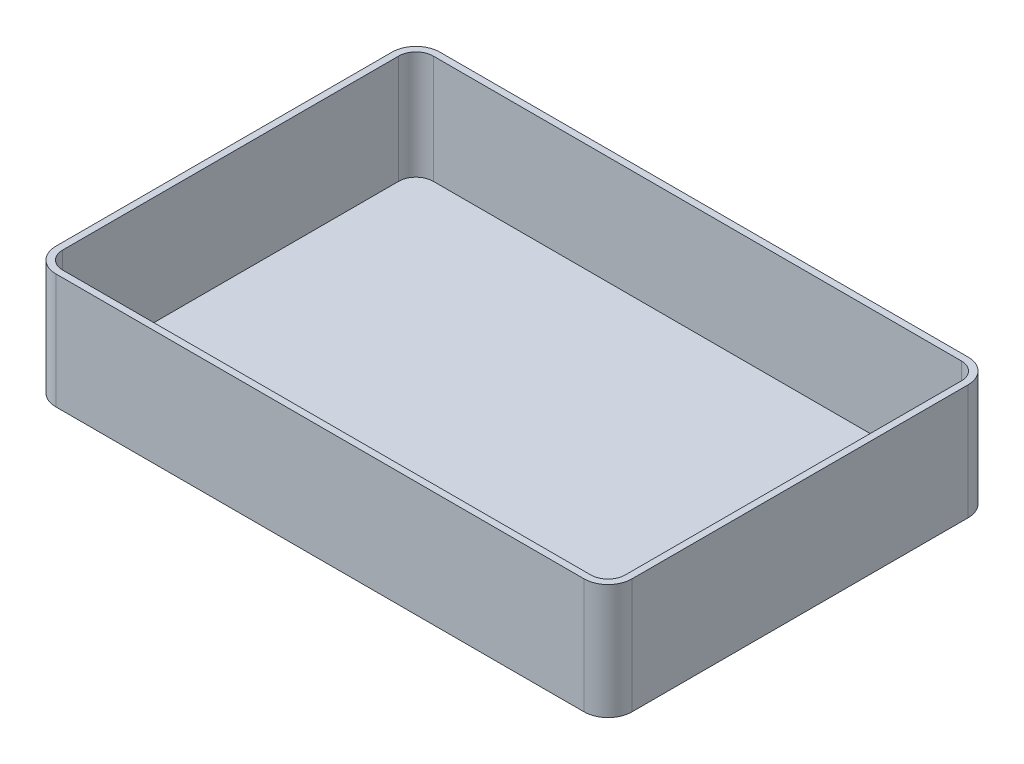
ISO-10303-21;
HEADER;
FILE_DESCRIPTION(('STEP AP214'),'2;1');
FILE_NAME('part.step','',(''),(''),'','','');
FILE_SCHEMA(('AUTOMOTIVE_DESIGN { 1 0 10303 214 1 1 1 1 }'));
ENDSEC;
DATA;
#1=APPLICATION_CONTEXT('core data for automotive mechanical design processes');
#2=APPLICATION_PROTOCOL_DEFINITION('international standard','automotive_design',2000,#1);
#3=PRODUCT_CONTEXT('',#1,'mechanical');
#4=PRODUCT('Part','Part','',(#3));
#5=PRODUCT_RELATED_PRODUCT_CATEGORY('part','',(#4));
#6=PRODUCT_DEFINITION_FORMATION('','',#4);
#7=PRODUCT_DEFINITION_CONTEXT('part definition',#1,'design');
#8=PRODUCT_DEFINITION('design','',#6,#7);
#9=PRODUCT_DEFINITION_SHAPE('','',#8);
#10=(LENGTH_UNIT() NAMED_UNIT(*) SI_UNIT(.MILLI.,.METRE.));
#11=(NAMED_UNIT(*) PLANE_ANGLE_UNIT() SI_UNIT($,.RADIAN.));
#12=(NAMED_UNIT(*) SI_UNIT($,.STERADIAN.) SOLID_ANGLE_UNIT());
#13=UNCERTAINTY_MEASURE_WITH_UNIT(LENGTH_MEASURE(1.E-05),#10,'distance_accuracy_value','');
#14=(GEOMETRIC_REPRESENTATION_CONTEXT(3) GLOBAL_UNCERTAINTY_ASSIGNED_CONTEXT((#13)) GLOBAL_UNIT_ASSIGNED_CONTEXT((#10,
#11,#12)) REPRESENTATION_CONTEXT('',''));
#15=CARTESIAN_POINT('',(0.,0.,0.));
#16=DIRECTION('',(0.,0.,1.));
#17=DIRECTION('',(1.,0.,0.));
#18=AXIS2_PLACEMENT_3D('',#15,#16,#17);
#19=CARTESIAN_POINT('',(275.,120.,-175.));
#20=DIRECTION('',(0.,-1.,0.));
#21=DIRECTION('',(0.,0.,-1.));
#22=AXIS2_PLACEMENT_3D('',#19,#20,#21);
#23=PLANE('',#22);
#24=CARTESIAN_POINT('',(275.,120.,-175.));
#25=DIRECTION('',(0.,1.,0.));
#26=DIRECTION('',(0.,0.,-1.));
#27=AXIS2_PLACEMENT_3D('',#24,#25,#26);
#28=CIRCLE('',#27,25.);
#29=CARTESIAN_POINT('',(300.,120.,-175.));
#30=VERTEX_POINT('',#29);
#31=CARTESIAN_POINT('',(275.,120.,-200.));
#32=VERTEX_POINT('',#31);
#33=EDGE_CURVE('E161',#30,#32,#28,.T.);
#34=ORIENTED_EDGE('',*,*,#33,.T.);
#35=DIRECTION('',(-1.,0.,0.));
#36=VECTOR('',#35,1.);
#37=CARTESIAN_POINT('',(-275.,120.,-200.));
#38=LINE('',#37,#36);
#39=CARTESIAN_POINT('',(-275.,120.,-200.));
#40=VERTEX_POINT('',#39);
#41=EDGE_CURVE('E102',#32,#40,#38,.T.);
#42=ORIENTED_EDGE('',*,*,#41,.T.);
#43=CARTESIAN_POINT('',(-275.,120.,-175.));
#44=DIRECTION('',(0.,1.,0.));
#45=DIRECTION('',(0.,0.,-1.));
#46=AXIS2_PLACEMENT_3D('',#43,#44,#45);
#47=CIRCLE('',#46,25.);
#48=CARTESIAN_POINT('',(-300.,120.,-175.));
#49=VERTEX_POINT('',#48);
#50=EDGE_CURVE('E176',#40,#49,#47,.T.);
#51=ORIENTED_EDGE('',*,*,#50,.T.);
#52=DIRECTION('',(0.,0.,1.));
#53=VECTOR('',#52,1.);
#54=CARTESIAN_POINT('',(-300.,120.,175.));
#55=LINE('',#54,#53);
#56=CARTESIAN_POINT('',(-300.,120.,175.));
#57=VERTEX_POINT('',#56);
#58=EDGE_CURVE('E188',#49,#57,#55,.T.);
#59=ORIENTED_EDGE('',*,*,#58,.T.);
#60=CARTESIAN_POINT('',(-275.,120.,175.));
#61=DIRECTION('',(0.,1.,0.));
#62=DIRECTION('',(0.,0.,-1.));
#63=AXIS2_PLACEMENT_3D('',#60,#61,#62);
#64=CIRCLE('',#63,25.);
#65=CARTESIAN_POINT('',(-275.,120.,200.));
#66=VERTEX_POINT('',#65);
#67=EDGE_CURVE('E124',#57,#66,#64,.T.);
#68=ORIENTED_EDGE('',*,*,#67,.T.);
#69=DIRECTION('',(1.,0.,0.));
#70=VECTOR('',#69,1.);
#71=CARTESIAN_POINT('',(-275.,120.,200.));
#72=LINE('',#71,#70);
#73=CARTESIAN_POINT('',(275.,120.,200.));
#74=VERTEX_POINT('',#73);
#75=EDGE_CURVE('E117',#66,#74,#72,.T.);
#76=ORIENTED_EDGE('',*,*,#75,.T.);
#77=CARTESIAN_POINT('',(275.,120.,175.));
#78=DIRECTION('',(0.,1.,0.));
#79=DIRECTION('',(0.,0.,1.));
#80=AXIS2_PLACEMENT_3D('',#77,#78,#79);
#81=CIRCLE('',#80,25.);
#82=CARTESIAN_POINT('',(300.,120.,175.));
#83=VERTEX_POINT('',#82);
#84=EDGE_CURVE('E121',#74,#83,#81,.T.);
#85=ORIENTED_EDGE('',*,*,#84,.T.);
#86=DIRECTION('',(0.,0.,-1.));
#87=VECTOR('',#86,1.);
#88=CARTESIAN_POINT('',(300.,120.,175.));
#89=LINE('',#88,#87);
#90=EDGE_CURVE('E61',#83,#30,#89,.T.);
#91=ORIENTED_EDGE('',*,*,#90,.T.);
#92=EDGE_LOOP('',(#34,#42,#51,#59,#68,#76,#85,#91));
#93=FACE_BOUND('',#92,.T.);
#94=CARTESIAN_POINT('',(275.,120.,-175.));
#95=DIRECTION('',(0.,-1.,0.));
#96=DIRECTION('',(0.,0.,-1.));
#97=AXIS2_PLACEMENT_3D('',#94,#95,#96);
#98=CIRCLE('',#97,18.);
#99=CARTESIAN_POINT('',(293.,120.,-175.));
#100=VERTEX_POINT('',#99);
#101=CARTESIAN_POINT('',(275.,120.,-193.));
#102=VERTEX_POINT('',#101);
#103=EDGE_CURVE('E214',#100,#102,#98,.F.);
#104=ORIENTED_EDGE('',*,*,#103,.F.);
#105=DIRECTION('',(0.,0.,-1.));
#106=VECTOR('',#105,1.);
#107=CARTESIAN_POINT('',(293.,120.,-175.));
#108=LINE('',#107,#106);
#109=CARTESIAN_POINT('',(293.,120.,175.));
#110=VERTEX_POINT('',#109);
#111=EDGE_CURVE('E194',#110,#100,#108,.T.);
#112=ORIENTED_EDGE('',*,*,#111,.F.);
#113=CARTESIAN_POINT('',(275.,120.,175.));
#114=DIRECTION('',(0.,-1.,0.));
#115=DIRECTION('',(0.,0.,-1.));
#116=AXIS2_PLACEMENT_3D('',#113,#114,#115);
#117=CIRCLE('',#116,18.);
#118=CARTESIAN_POINT('',(275.,120.,193.));
#119=VERTEX_POINT('',#118);
#120=EDGE_CURVE('E197',#119,#110,#117,.F.);
#121=ORIENTED_EDGE('',*,*,#120,.F.);
#122=DIRECTION('',(1.,0.,0.));
#123=VECTOR('',#122,1.);
#124=CARTESIAN_POINT('',(275.,120.,193.));
#125=LINE('',#124,#123);
#126=CARTESIAN_POINT('',(-275.,120.,193.));
#127=VERTEX_POINT('',#126);
#128=EDGE_CURVE('E199',#127,#119,#125,.T.);
#129=ORIENTED_EDGE('',*,*,#128,.F.);
#130=CARTESIAN_POINT('',(-275.,120.,175.));
#131=DIRECTION('',(0.,-1.,0.));
#132=DIRECTION('',(0.,0.,-1.));
#133=AXIS2_PLACEMENT_3D('',#130,#131,#132);
#134=CIRCLE('',#133,18.);
#135=CARTESIAN_POINT('',(-293.,120.,175.));
#136=VERTEX_POINT('',#135);
#137=EDGE_CURVE('E202',#136,#127,#134,.F.);
#138=ORIENTED_EDGE('',*,*,#137,.F.);
#139=DIRECTION('',(0.,0.,1.));
#140=VECTOR('',#139,1.);
#141=CARTESIAN_POINT('',(-293.,120.,-175.));
#142=LINE('',#141,#140);
#143=CARTESIAN_POINT('',(-293.,120.,-175.));
#144=VERTEX_POINT('',#143);
#145=EDGE_CURVE('E205',#144,#136,#142,.T.);
#146=ORIENTED_EDGE('',*,*,#145,.F.);
#147=CARTESIAN_POINT('',(-275.,120.,-175.));
#148=DIRECTION('',(0.,-1.,0.));
#149=DIRECTION('',(0.,0.,-1.));
#150=AXIS2_PLACEMENT_3D('',#147,#148,#149);
#151=CIRCLE('',#150,18.);
#152=CARTESIAN_POINT('',(-275.,120.,-193.));
#153=VERTEX_POINT('',#152);
#154=EDGE_CURVE('E208',#153,#144,#151,.F.);
#155=ORIENTED_EDGE('',*,*,#154,.F.);
#156=DIRECTION('',(-1.,0.,0.));
#157=VECTOR('',#156,1.);
#158=CARTESIAN_POINT('',(275.,120.,-193.));
#159=LINE('',#158,#157);
#160=EDGE_CURVE('E211',#102,#153,#159,.T.);
#161=ORIENTED_EDGE('',*,*,#160,.F.);
#162=EDGE_LOOP('',(#104,#112,#121,#129,#138,#146,#155,#161));
#163=FACE_BOUND('',#162,.T.);
#164=ADVANCED_FACE('F37',(#93,#163),#23,.F.);
#165=CARTESIAN_POINT('',(275.,120.,-175.));
#166=DIRECTION('',(0.,-1.,0.));
#167=DIRECTION('',(0.,0.,-1.));
#168=AXIS2_PLACEMENT_3D('',#165,#166,#167);
#169=CYLINDRICAL_SURFACE('',#168,25.);
#170=CARTESIAN_POINT('',(275.,0.,-175.));
#171=DIRECTION('',(0.,1.,0.));
#172=DIRECTION('',(0.,0.,-1.));
#173=AXIS2_PLACEMENT_3D('',#170,#171,#172);
#174=CIRCLE('',#173,25.);
#175=CARTESIAN_POINT('',(300.,0.,-175.));
#176=VERTEX_POINT('',#175);
#177=CARTESIAN_POINT('',(275.,0.,-200.));
#178=VERTEX_POINT('',#177);
#179=EDGE_CURVE('E145',#176,#178,#174,.T.);
#180=ORIENTED_EDGE('',*,*,#179,.T.);
#181=DIRECTION('',(0.,-1.,0.));
#182=VECTOR('',#181,1.);
#183=CARTESIAN_POINT('',(275.,120.,-200.));
#184=LINE('',#183,#182);
#185=EDGE_CURVE('E11',#32,#178,#184,.T.);
#186=ORIENTED_EDGE('',*,*,#185,.F.);
#187=ORIENTED_EDGE('',*,*,#33,.F.);
#188=DIRECTION('',(0.,-1.,0.));
#189=VECTOR('',#188,1.);
#190=CARTESIAN_POINT('',(300.,120.,-175.));
#191=LINE('',#190,#189);
#192=EDGE_CURVE('E141',#30,#176,#191,.T.);
#193=ORIENTED_EDGE('',*,*,#192,.T.);
#194=EDGE_LOOP('',(#180,#186,#187,#193));
#195=FACE_BOUND('',#194,.T.);
#196=ADVANCED_FACE('F39',(#195),#169,.T.);
#197=CARTESIAN_POINT('',(-275.,120.,-200.));
#198=DIRECTION('',(0.,0.,1.));
#199=DIRECTION('',(1.,0.,0.));
#200=AXIS2_PLACEMENT_3D('',#197,#198,#199);
#201=PLANE('',#200);
#202=DIRECTION('',(-1.,0.,0.));
#203=VECTOR('',#202,1.);
#204=CARTESIAN_POINT('',(-275.,0.,-200.));
#205=LINE('',#204,#203);
#206=CARTESIAN_POINT('',(-275.,0.,-200.));
#207=VERTEX_POINT('',#206);
#208=EDGE_CURVE('E148',#178,#207,#205,.T.);
#209=ORIENTED_EDGE('',*,*,#208,.T.);
#210=DIRECTION('',(0.,-1.,0.));
#211=VECTOR('',#210,1.);
#212=CARTESIAN_POINT('',(-275.,120.,-200.));
#213=LINE('',#212,#211);
#214=EDGE_CURVE('E45',#40,#207,#213,.T.);
#215=ORIENTED_EDGE('',*,*,#214,.F.);
#216=ORIENTED_EDGE('',*,*,#41,.F.);
#217=ORIENTED_EDGE('',*,*,#185,.T.);
#218=EDGE_LOOP('',(#209,#215,#216,#217));
#219=FACE_BOUND('',#218,.T.);
#220=ADVANCED_FACE('F333',(#219),#201,.F.);
#221=CARTESIAN_POINT('',(-275.,120.,-175.));
#222=DIRECTION('',(0.,-1.,0.));
#223=DIRECTION('',(0.,0.,-1.));
#224=AXIS2_PLACEMENT_3D('',#221,#222,#223);
#225=CYLINDRICAL_SURFACE('',#224,25.);
#226=CARTESIAN_POINT('',(-275.,0.,-175.));
#227=DIRECTION('',(0.,1.,0.));
#228=DIRECTION('',(0.,0.,-1.));
#229=AXIS2_PLACEMENT_3D('',#226,#227,#228);
#230=CIRCLE('',#229,25.);
#231=CARTESIAN_POINT('',(-300.,0.,-175.));
#232=VERTEX_POINT('',#231);
#233=EDGE_CURVE('E151',#207,#232,#230,.T.);
#234=ORIENTED_EDGE('',*,*,#233,.T.);
#235=DIRECTION('',(0.,-1.,0.));
#236=VECTOR('',#235,1.);
#237=CARTESIAN_POINT('',(-300.,120.,-175.));
#238=LINE('',#237,#236);
#239=EDGE_CURVE('E168',#49,#232,#238,.T.);
#240=ORIENTED_EDGE('',*,*,#239,.F.);
#241=ORIENTED_EDGE('',*,*,#50,.F.);
#242=ORIENTED_EDGE('',*,*,#214,.T.);
#243=EDGE_LOOP('',(#234,#240,#241,#242));
#244=FACE_BOUND('',#243,.T.);
#245=ADVANCED_FACE('F174',(#244),#225,.T.);
#246=CARTESIAN_POINT('',(-300.,120.,175.));
#247=DIRECTION('',(1.,0.,0.));
#248=DIRECTION('',(0.,0.,-1.));
#249=AXIS2_PLACEMENT_3D('',#246,#247,#248);
#250=PLANE('',#249);
#251=DIRECTION('',(0.,0.,1.));
#252=VECTOR('',#251,1.);
#253=CARTESIAN_POINT('',(-300.,0.,175.));
#254=LINE('',#253,#252);
#255=CARTESIAN_POINT('',(-300.,0.,175.));
#256=VERTEX_POINT('',#255);
#257=EDGE_CURVE('E153',#232,#256,#254,.T.);
#258=ORIENTED_EDGE('',*,*,#257,.T.);
#259=DIRECTION('',(0.,-1.,0.));
#260=VECTOR('',#259,1.);
#261=CARTESIAN_POINT('',(-300.,120.,175.));
#262=LINE('',#261,#260);
#263=EDGE_CURVE('E165',#57,#256,#262,.T.);
#264=ORIENTED_EDGE('',*,*,#263,.F.);
#265=ORIENTED_EDGE('',*,*,#58,.F.);
#266=ORIENTED_EDGE('',*,*,#239,.T.);
#267=EDGE_LOOP('',(#258,#264,#265,#266));
#268=FACE_BOUND('',#267,.T.);
#269=ADVANCED_FACE('F184',(#268),#250,.F.);
#270=CARTESIAN_POINT('',(-275.,120.,175.));
#271=DIRECTION('',(0.,-1.,0.));
#272=DIRECTION('',(0.,0.,-1.));
#273=AXIS2_PLACEMENT_3D('',#270,#271,#272);
#274=CYLINDRICAL_SURFACE('',#273,25.);
#275=CARTESIAN_POINT('',(-275.,0.,175.));
#276=DIRECTION('',(0.,1.,0.));
#277=DIRECTION('',(0.,0.,-1.));
#278=AXIS2_PLACEMENT_3D('',#275,#276,#277);
#279=CIRCLE('',#278,25.);
#280=CARTESIAN_POINT('',(-275.,0.,200.));
#281=VERTEX_POINT('',#280);
#282=EDGE_CURVE('E155',#256,#281,#279,.T.);
#283=ORIENTED_EDGE('',*,*,#282,.T.);
#284=DIRECTION('',(0.,-1.,0.));
#285=VECTOR('',#284,1.);
#286=CARTESIAN_POINT('',(-275.,120.,200.));
#287=LINE('',#286,#285);
#288=EDGE_CURVE('E136',#66,#281,#287,.T.);
#289=ORIENTED_EDGE('',*,*,#288,.F.);
#290=ORIENTED_EDGE('',*,*,#67,.F.);
#291=ORIENTED_EDGE('',*,*,#263,.T.);
#292=EDGE_LOOP('',(#283,#289,#290,#291));
#293=FACE_BOUND('',#292,.T.);
#294=ADVANCED_FACE('F187',(#293),#274,.T.);
#295=CARTESIAN_POINT('',(-275.,120.,200.));
#296=DIRECTION('',(0.,0.,-1.));
#297=DIRECTION('',(-1.,0.,0.));
#298=AXIS2_PLACEMENT_3D('',#295,#296,#297);
#299=PLANE('',#298);
#300=DIRECTION('',(1.,0.,0.));
#301=VECTOR('',#300,1.);
#302=CARTESIAN_POINT('',(-275.,0.,200.));
#303=LINE('',#302,#301);
#304=CARTESIAN_POINT('',(275.,0.,200.));
#305=VERTEX_POINT('',#304);
#306=EDGE_CURVE('E133',#281,#305,#303,.T.);
#307=ORIENTED_EDGE('',*,*,#306,.T.);
#308=DIRECTION('',(0.,-1.,0.));
#309=VECTOR('',#308,1.);
#310=CARTESIAN_POINT('',(275.,120.,200.));
#311=LINE('',#310,#309);
#312=EDGE_CURVE('E130',#74,#305,#311,.T.);
#313=ORIENTED_EDGE('',*,*,#312,.F.);
#314=ORIENTED_EDGE('',*,*,#75,.F.);
#315=ORIENTED_EDGE('',*,*,#288,.T.);
#316=EDGE_LOOP('',(#307,#313,#314,#315));
#317=FACE_BOUND('',#316,.T.);
#318=ADVANCED_FACE('F131',(#317),#299,.F.);
#319=CARTESIAN_POINT('',(275.,120.,175.));
#320=DIRECTION('',(0.,-1.,0.));
#321=DIRECTION('',(0.,0.,-1.));
#322=AXIS2_PLACEMENT_3D('',#319,#320,#321);
#323=CYLINDRICAL_SURFACE('',#322,25.);
#324=CARTESIAN_POINT('',(275.,0.,175.));
#325=DIRECTION('',(0.,1.,0.));
#326=DIRECTION('',(0.,0.,1.));
#327=AXIS2_PLACEMENT_3D('',#324,#325,#326);
#328=CIRCLE('',#327,25.);
#329=CARTESIAN_POINT('',(300.,0.,175.));
#330=VERTEX_POINT('',#329);
#331=EDGE_CURVE('E158',#305,#330,#328,.T.);
#332=ORIENTED_EDGE('',*,*,#331,.T.);
#333=DIRECTION('',(0.,-1.,0.));
#334=VECTOR('',#333,1.);
#335=CARTESIAN_POINT('',(300.,120.,175.));
#336=LINE('',#335,#334);
#337=EDGE_CURVE('E137',#83,#330,#336,.T.);
#338=ORIENTED_EDGE('',*,*,#337,.F.);
#339=ORIENTED_EDGE('',*,*,#84,.F.);
#340=ORIENTED_EDGE('',*,*,#312,.T.);
#341=EDGE_LOOP('',(#332,#338,#339,#340));
#342=FACE_BOUND('',#341,.T.);
#343=ADVANCED_FACE('F139',(#342),#323,.T.);
#344=CARTESIAN_POINT('',(300.,120.,175.));
#345=DIRECTION('',(-1.,0.,0.));
#346=DIRECTION('',(0.,0.,1.));
#347=AXIS2_PLACEMENT_3D('',#344,#345,#346);
#348=PLANE('',#347);
#349=DIRECTION('',(0.,0.,-1.));
#350=VECTOR('',#349,1.);
#351=CARTESIAN_POINT('',(300.,0.,175.));
#352=LINE('',#351,#350);
#353=EDGE_CURVE('E94',#330,#176,#352,.T.);
#354=ORIENTED_EDGE('',*,*,#353,.T.);
#355=ORIENTED_EDGE('',*,*,#192,.F.);
#356=ORIENTED_EDGE('',*,*,#90,.F.);
#357=ORIENTED_EDGE('',*,*,#337,.T.);
#358=EDGE_LOOP('',(#354,#355,#356,#357));
#359=FACE_BOUND('',#358,.T.);
#360=ADVANCED_FACE('F339',(#359),#348,.F.);
#361=CARTESIAN_POINT('',(275.,0.,-175.));
#362=DIRECTION('',(0.,-1.,0.));
#363=DIRECTION('',(0.,0.,-1.));
#364=AXIS2_PLACEMENT_3D('',#361,#362,#363);
#365=PLANE('',#364);
#366=ORIENTED_EDGE('',*,*,#179,.F.);
#367=ORIENTED_EDGE('',*,*,#353,.F.);
#368=ORIENTED_EDGE('',*,*,#331,.F.);
#369=ORIENTED_EDGE('',*,*,#306,.F.);
#370=ORIENTED_EDGE('',*,*,#282,.F.);
#371=ORIENTED_EDGE('',*,*,#257,.F.);
#372=ORIENTED_EDGE('',*,*,#233,.F.);
#373=ORIENTED_EDGE('',*,*,#208,.F.);
#374=EDGE_LOOP('',(#366,#367,#368,#369,#370,#371,#372,#373));
#375=FACE_BOUND('',#374,.T.);
#376=ADVANCED_FACE('F180',(#375),#365,.T.);
#377=CARTESIAN_POINT('',(275.,120.,-175.));
#378=DIRECTION('',(0.,-1.,0.));
#379=DIRECTION('',(0.,0.,-1.));
#380=AXIS2_PLACEMENT_3D('',#377,#378,#379);
#381=CYLINDRICAL_SURFACE('',#380,18.);
#382=CARTESIAN_POINT('',(275.,7.00000000000001,-175.));
#383=DIRECTION('',(0.,-1.,0.));
#384=DIRECTION('',(0.,0.,-1.));
#385=AXIS2_PLACEMENT_3D('',#382,#383,#384);
#386=CIRCLE('',#385,18.);
#387=CARTESIAN_POINT('',(293.,7.00000000000001,-175.));
#388=VERTEX_POINT('',#387);
#389=CARTESIAN_POINT('',(275.,7.00000000000001,-193.));
#390=VERTEX_POINT('',#389);
#391=EDGE_CURVE('E254',#388,#390,#386,.F.);
#392=ORIENTED_EDGE('',*,*,#391,.F.);
#393=DIRECTION('',(0.,-1.,0.));
#394=VECTOR('',#393,1.);
#395=CARTESIAN_POINT('',(293.,120.,-175.));
#396=LINE('',#395,#394);
#397=EDGE_CURVE('E196',#100,#388,#396,.T.);
#398=ORIENTED_EDGE('',*,*,#397,.F.);
#399=ORIENTED_EDGE('',*,*,#103,.T.);
#400=DIRECTION('',(0.,1.,0.));
#401=VECTOR('',#400,1.);
#402=CARTESIAN_POINT('',(275.,120.,-193.));
#403=LINE('',#402,#401);
#404=EDGE_CURVE('E149',#102,#390,#403,.F.);
#405=ORIENTED_EDGE('',*,*,#404,.T.);
#406=EDGE_LOOP('',(#392,#398,#399,#405));
#407=FACE_BOUND('',#406,.T.);
#408=ADVANCED_FACE('F270',(#407),#381,.F.);
#409=CARTESIAN_POINT('',(-275.,120.,-193.));
#410=DIRECTION('',(0.,0.,1.));
#411=DIRECTION('',(1.,0.,0.));
#412=AXIS2_PLACEMENT_3D('',#409,#410,#411);
#413=PLANE('',#412);
#414=DIRECTION('',(-1.,0.,0.));
#415=VECTOR('',#414,1.);
#416=CARTESIAN_POINT('',(275.,7.,-193.));
#417=LINE('',#416,#415);
#418=CARTESIAN_POINT('',(-275.,7.00000000000001,-193.));
#419=VERTEX_POINT('',#418);
#420=EDGE_CURVE('E249',#390,#419,#417,.T.);
#421=ORIENTED_EDGE('',*,*,#420,.F.);
#422=ORIENTED_EDGE('',*,*,#404,.F.);
#423=ORIENTED_EDGE('',*,*,#160,.T.);
#424=DIRECTION('',(0.,-1.,0.));
#425=VECTOR('',#424,1.);
#426=CARTESIAN_POINT('',(-275.,120.,-193.));
#427=LINE('',#426,#425);
#428=EDGE_CURVE('E246',#153,#419,#427,.T.);
#429=ORIENTED_EDGE('',*,*,#428,.T.);
#430=EDGE_LOOP('',(#421,#422,#423,#429));
#431=FACE_BOUND('',#430,.T.);
#432=ADVANCED_FACE('F299',(#431),#413,.T.);
#433=CARTESIAN_POINT('',(-275.,120.,-175.));
#434=DIRECTION('',(0.,-1.,0.));
#435=DIRECTION('',(0.,0.,-1.));
#436=AXIS2_PLACEMENT_3D('',#433,#434,#435);
#437=CYLINDRICAL_SURFACE('',#436,18.);
#438=CARTESIAN_POINT('',(-275.,7.00000000000001,-175.));
#439=DIRECTION('',(0.,-1.,0.));
#440=DIRECTION('',(0.,0.,-1.));
#441=AXIS2_PLACEMENT_3D('',#438,#439,#440);
#442=CIRCLE('',#441,18.);
#443=CARTESIAN_POINT('',(-293.,7.00000000000001,-175.));
#444=VERTEX_POINT('',#443);
#445=EDGE_CURVE('E243',#419,#444,#442,.F.);
#446=ORIENTED_EDGE('',*,*,#445,.F.);
#447=ORIENTED_EDGE('',*,*,#428,.F.);
#448=ORIENTED_EDGE('',*,*,#154,.T.);
#449=DIRECTION('',(0.,1.,0.));
#450=VECTOR('',#449,1.);
#451=CARTESIAN_POINT('',(-293.,120.,-175.));
#452=LINE('',#451,#450);
#453=EDGE_CURVE('E240',#144,#444,#452,.F.);
#454=ORIENTED_EDGE('',*,*,#453,.T.);
#455=EDGE_LOOP('',(#446,#447,#448,#454));
#456=FACE_BOUND('',#455,.T.);
#457=ADVANCED_FACE('F305',(#456),#437,.F.);
#458=CARTESIAN_POINT('',(-293.,120.,175.));
#459=DIRECTION('',(1.,0.,0.));
#460=DIRECTION('',(0.,0.,-1.));
#461=AXIS2_PLACEMENT_3D('',#458,#459,#460);
#462=PLANE('',#461);
#463=DIRECTION('',(0.,0.,1.));
#464=VECTOR('',#463,1.);
#465=CARTESIAN_POINT('',(-293.,7.,-175.));
#466=LINE('',#465,#464);
#467=CARTESIAN_POINT('',(-293.,7.00000000000001,175.));
#468=VERTEX_POINT('',#467);
#469=EDGE_CURVE('E237',#444,#468,#466,.T.);
#470=ORIENTED_EDGE('',*,*,#469,.F.);
#471=ORIENTED_EDGE('',*,*,#453,.F.);
#472=ORIENTED_EDGE('',*,*,#145,.T.);
#473=DIRECTION('',(0.,-1.,0.));
#474=VECTOR('',#473,1.);
#475=CARTESIAN_POINT('',(-293.,120.,175.));
#476=LINE('',#475,#474);
#477=EDGE_CURVE('E234',#136,#468,#476,.T.);
#478=ORIENTED_EDGE('',*,*,#477,.T.);
#479=EDGE_LOOP('',(#470,#471,#472,#478));
#480=FACE_BOUND('',#479,.T.);
#481=ADVANCED_FACE('F404',(#480),#462,.T.);
#482=CARTESIAN_POINT('',(-275.,120.,175.));
#483=DIRECTION('',(0.,-1.,0.));
#484=DIRECTION('',(0.,0.,-1.));
#485=AXIS2_PLACEMENT_3D('',#482,#483,#484);
#486=CYLINDRICAL_SURFACE('',#485,18.);
#487=CARTESIAN_POINT('',(-275.,7.00000000000001,175.));
#488=DIRECTION('',(0.,-1.,0.));
#489=DIRECTION('',(0.,0.,-1.));
#490=AXIS2_PLACEMENT_3D('',#487,#488,#489);
#491=CIRCLE('',#490,18.);
#492=CARTESIAN_POINT('',(-275.,7.00000000000001,193.));
#493=VERTEX_POINT('',#492);
#494=EDGE_CURVE('E231',#468,#493,#491,.F.);
#495=ORIENTED_EDGE('',*,*,#494,.F.);
#496=ORIENTED_EDGE('',*,*,#477,.F.);
#497=ORIENTED_EDGE('',*,*,#137,.T.);
#498=DIRECTION('',(0.,1.,0.));
#499=VECTOR('',#498,1.);
#500=CARTESIAN_POINT('',(-275.,120.,193.));
#501=LINE('',#500,#499);
#502=EDGE_CURVE('E228',#127,#493,#501,.F.);
#503=ORIENTED_EDGE('',*,*,#502,.T.);
#504=EDGE_LOOP('',(#495,#496,#497,#503));
#505=FACE_BOUND('',#504,.T.);
#506=ADVANCED_FACE('F326',(#505),#486,.F.);
#507=CARTESIAN_POINT('',(-275.,120.,193.));
#508=DIRECTION('',(0.,0.,-1.));
#509=DIRECTION('',(-1.,0.,0.));
#510=AXIS2_PLACEMENT_3D('',#507,#508,#509);
#511=PLANE('',#510);
#512=DIRECTION('',(1.,0.,0.));
#513=VECTOR('',#512,1.);
#514=CARTESIAN_POINT('',(275.,7.,193.));
#515=LINE('',#514,#513);
#516=CARTESIAN_POINT('',(275.,7.00000000000001,193.));
#517=VERTEX_POINT('',#516);
#518=EDGE_CURVE('E225',#493,#517,#515,.T.);
#519=ORIENTED_EDGE('',*,*,#518,.F.);
#520=ORIENTED_EDGE('',*,*,#502,.F.);
#521=ORIENTED_EDGE('',*,*,#128,.T.);
#522=DIRECTION('',(0.,-1.,0.));
#523=VECTOR('',#522,1.);
#524=CARTESIAN_POINT('',(275.,120.,193.));
#525=LINE('',#524,#523);
#526=EDGE_CURVE('E222',#119,#517,#525,.T.);
#527=ORIENTED_EDGE('',*,*,#526,.T.);
#528=EDGE_LOOP('',(#519,#520,#521,#527));
#529=FACE_BOUND('',#528,.T.);
#530=ADVANCED_FACE('F316',(#529),#511,.T.);
#531=CARTESIAN_POINT('',(275.,120.,175.));
#532=DIRECTION('',(0.,-1.,0.));
#533=DIRECTION('',(0.,0.,-1.));
#534=AXIS2_PLACEMENT_3D('',#531,#532,#533);
#535=CYLINDRICAL_SURFACE('',#534,18.);
#536=CARTESIAN_POINT('',(275.,7.00000000000001,175.));
#537=DIRECTION('',(0.,-1.,0.));
#538=DIRECTION('',(0.,0.,-1.));
#539=AXIS2_PLACEMENT_3D('',#536,#537,#538);
#540=CIRCLE('',#539,18.);
#541=CARTESIAN_POINT('',(293.,7.00000000000001,175.));
#542=VERTEX_POINT('',#541);
#543=EDGE_CURVE('E220',#517,#542,#540,.F.);
#544=ORIENTED_EDGE('',*,*,#543,.F.);
#545=ORIENTED_EDGE('',*,*,#526,.F.);
#546=ORIENTED_EDGE('',*,*,#120,.T.);
#547=DIRECTION('',(0.,1.,0.));
#548=VECTOR('',#547,1.);
#549=CARTESIAN_POINT('',(293.,120.,175.));
#550=LINE('',#549,#548);
#551=EDGE_CURVE('E52',#110,#542,#550,.F.);
#552=ORIENTED_EDGE('',*,*,#551,.T.);
#553=EDGE_LOOP('',(#544,#545,#546,#552));
#554=FACE_BOUND('',#553,.T.);
#555=ADVANCED_FACE('F318',(#554),#535,.F.);
#556=CARTESIAN_POINT('',(293.,120.,175.));
#557=DIRECTION('',(-1.,0.,0.));
#558=DIRECTION('',(0.,0.,1.));
#559=AXIS2_PLACEMENT_3D('',#556,#557,#558);
#560=PLANE('',#559);
#561=DIRECTION('',(0.,0.,-1.));
#562=VECTOR('',#561,1.);
#563=CARTESIAN_POINT('',(293.,7.,-175.));
#564=LINE('',#563,#562);
#565=EDGE_CURVE('E217',#542,#388,#564,.T.);
#566=ORIENTED_EDGE('',*,*,#565,.F.);
#567=ORIENTED_EDGE('',*,*,#551,.F.);
#568=ORIENTED_EDGE('',*,*,#111,.T.);
#569=ORIENTED_EDGE('',*,*,#397,.T.);
#570=EDGE_LOOP('',(#566,#567,#568,#569));
#571=FACE_BOUND('',#570,.T.);
#572=ADVANCED_FACE('F294',(#571),#560,.T.);
#573=CARTESIAN_POINT('',(275.,7.,-175.));
#574=DIRECTION('',(0.,-1.,0.));
#575=DIRECTION('',(0.,0.,-1.));
#576=AXIS2_PLACEMENT_3D('',#573,#574,#575);
#577=PLANE('',#576);
#578=ORIENTED_EDGE('',*,*,#391,.T.);
#579=ORIENTED_EDGE('',*,*,#420,.T.);
#580=ORIENTED_EDGE('',*,*,#445,.T.);
#581=ORIENTED_EDGE('',*,*,#469,.T.);
#582=ORIENTED_EDGE('',*,*,#494,.T.);
#583=ORIENTED_EDGE('',*,*,#518,.T.);
#584=ORIENTED_EDGE('',*,*,#543,.T.);
#585=ORIENTED_EDGE('',*,*,#565,.T.);
#586=EDGE_LOOP('',(#578,#579,#580,#581,#582,#583,#584,#585));
#587=FACE_BOUND('',#586,.T.);
#588=ADVANCED_FACE('F263',(#587),#577,.F.);
#589=CLOSED_SHELL('',(#164,#196,#220,#245,#269,#294,#318,#343,#360,#376,#408,#432,#457,#481,
#506,#530,#555,#572,#588));
#590=MANIFOLD_SOLID_BREP('B2',#589);
#591=ADVANCED_BREP_SHAPE_REPRESENTATION('',(#18,#590),#14);
#592=SHAPE_DEFINITION_REPRESENTATION(#9,#591);
ENDSEC;
END-ISO-10303-21;
